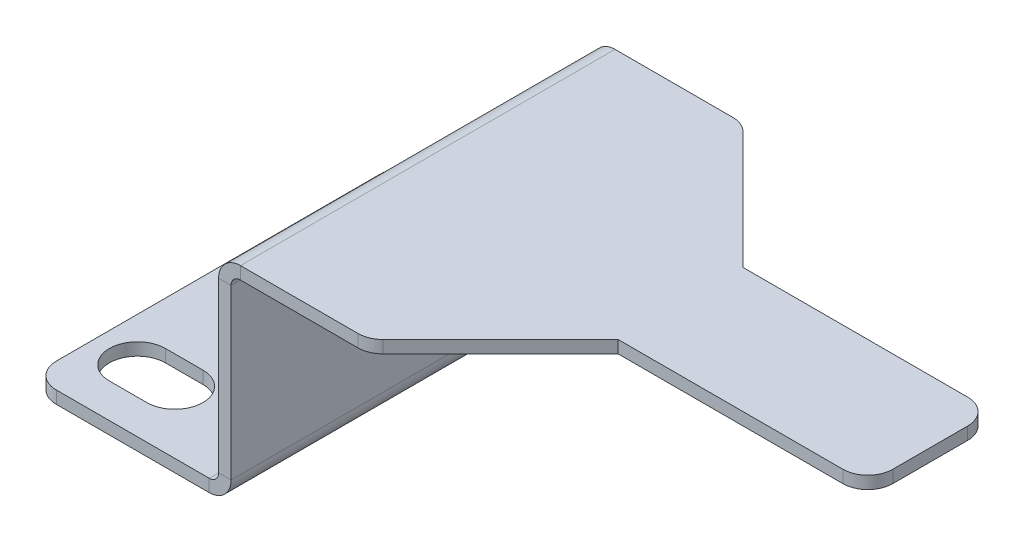
ISO-10303-21;
HEADER;
FILE_DESCRIPTION(('STEP AP214'),'2;1');
FILE_NAME('part.step','',(''),(''),'','','');
FILE_SCHEMA(('AUTOMOTIVE_DESIGN { 1 0 10303 214 1 1 1 1 }'));
ENDSEC;
DATA;
#1=APPLICATION_CONTEXT('core data for automotive mechanical design processes');
#2=APPLICATION_PROTOCOL_DEFINITION('international standard','automotive_design',2000,#1);
#3=PRODUCT_CONTEXT('',#1,'mechanical');
#4=PRODUCT('Part','Part','',(#3));
#5=PRODUCT_RELATED_PRODUCT_CATEGORY('part','',(#4));
#6=PRODUCT_DEFINITION_FORMATION('','',#4);
#7=PRODUCT_DEFINITION_CONTEXT('part definition',#1,'design');
#8=PRODUCT_DEFINITION('design','',#6,#7);
#9=PRODUCT_DEFINITION_SHAPE('','',#8);
#10=(LENGTH_UNIT() NAMED_UNIT(*) SI_UNIT(.MILLI.,.METRE.));
#11=(NAMED_UNIT(*) PLANE_ANGLE_UNIT() SI_UNIT($,.RADIAN.));
#12=(NAMED_UNIT(*) SI_UNIT($,.STERADIAN.) SOLID_ANGLE_UNIT());
#13=UNCERTAINTY_MEASURE_WITH_UNIT(LENGTH_MEASURE(1.E-05),#10,'distance_accuracy_value','');
#14=(GEOMETRIC_REPRESENTATION_CONTEXT(3) GLOBAL_UNCERTAINTY_ASSIGNED_CONTEXT((#13)) GLOBAL_UNIT_ASSIGNED_CONTEXT((#10,
#11,#12)) REPRESENTATION_CONTEXT('',''));
#15=CARTESIAN_POINT('',(0.,0.,0.));
#16=DIRECTION('',(0.,0.,1.));
#17=DIRECTION('',(1.,0.,0.));
#18=AXIS2_PLACEMENT_3D('',#15,#16,#17);
#19=CARTESIAN_POINT('',(15.,15.,30.));
#20=DIRECTION('',(0.,1.,0.));
#21=DIRECTION('',(0.,0.,1.));
#22=AXIS2_PLACEMENT_3D('',#19,#20,#21);
#23=PLANE('',#22);
#24=DIRECTION('',(1.,0.,0.));
#25=VECTOR('',#24,1.);
#26=CARTESIAN_POINT('',(15.,15.,0.));
#27=LINE('',#26,#25);
#28=CARTESIAN_POINT('',(16.75,15.,0.));
#29=VERTEX_POINT('',#28);
#30=CARTESIAN_POINT('',(26.1715728752538,15.,0.));
#31=VERTEX_POINT('',#30);
#32=EDGE_CURVE('E295',#29,#31,#27,.T.);
#33=ORIENTED_EDGE('',*,*,#32,.T.);
#34=CARTESIAN_POINT('',(26.1715728752538,15.,2.));
#35=DIRECTION('',(0.,1.,0.));
#36=DIRECTION('',(0.,0.,1.));
#37=AXIS2_PLACEMENT_3D('',#34,#35,#36);
#38=CIRCLE('',#37,2.);
#39=CARTESIAN_POINT('',(27.585786437627,15.,0.585786437626907));
#40=VERTEX_POINT('',#39);
#41=EDGE_CURVE('E460',#31,#40,#38,.F.);
#42=ORIENTED_EDGE('',*,*,#41,.T.);
#43=DIRECTION('',(0.707106781186547,0.,0.707106781186549));
#44=VECTOR('',#43,1.);
#45=CARTESIAN_POINT('',(36.,15.,9.));
#46=LINE('',#45,#44);
#47=CARTESIAN_POINT('',(37.,15.,10.));
#48=VERTEX_POINT('',#47);
#49=EDGE_CURVE('E288',#40,#48,#46,.T.);
#50=ORIENTED_EDGE('',*,*,#49,.T.);
#51=DIRECTION('',(1.,0.,0.));
#52=VECTOR('',#51,1.);
#53=CARTESIAN_POINT('',(15.,15.,10.));
#54=LINE('',#53,#52);
#55=CARTESIAN_POINT('',(55.,15.,10.));
#56=VERTEX_POINT('',#55);
#57=EDGE_CURVE('E283',#48,#56,#54,.T.);
#58=ORIENTED_EDGE('',*,*,#57,.T.);
#59=CARTESIAN_POINT('',(55.,15.,12.));
#60=DIRECTION('',(0.,1.,0.));
#61=DIRECTION('',(0.,0.,1.));
#62=AXIS2_PLACEMENT_3D('',#59,#60,#61);
#63=CIRCLE('',#62,2.);
#64=CARTESIAN_POINT('',(57.,15.,12.));
#65=VERTEX_POINT('',#64);
#66=EDGE_CURVE('E38',#56,#65,#63,.F.);
#67=ORIENTED_EDGE('',*,*,#66,.T.);
#68=DIRECTION('',(0.,0.,-1.));
#69=VECTOR('',#68,1.);
#70=CARTESIAN_POINT('',(57.,15.,30.));
#71=LINE('',#70,#69);
#72=CARTESIAN_POINT('',(57.,15.,18.));
#73=VERTEX_POINT('',#72);
#74=EDGE_CURVE('E384',#73,#65,#71,.T.);
#75=ORIENTED_EDGE('',*,*,#74,.F.);
#76=CARTESIAN_POINT('',(55.,15.,18.));
#77=DIRECTION('',(0.,1.,0.));
#78=DIRECTION('',(0.,0.,1.));
#79=AXIS2_PLACEMENT_3D('',#76,#77,#78);
#80=CIRCLE('',#79,2.);
#81=CARTESIAN_POINT('',(55.,15.,20.));
#82=VERTEX_POINT('',#81);
#83=EDGE_CURVE('E32',#73,#82,#80,.F.);
#84=ORIENTED_EDGE('',*,*,#83,.T.);
#85=DIRECTION('',(-1.,0.,0.));
#86=VECTOR('',#85,1.);
#87=CARTESIAN_POINT('',(15.,15.,20.));
#88=LINE('',#87,#86);
#89=CARTESIAN_POINT('',(37.,15.,20.));
#90=VERTEX_POINT('',#89);
#91=EDGE_CURVE('E275',#82,#90,#88,.T.);
#92=ORIENTED_EDGE('',*,*,#91,.T.);
#93=DIRECTION('',(-0.707106781186547,0.,0.707106781186549));
#94=VECTOR('',#93,1.);
#95=CARTESIAN_POINT('',(21.,15.,36.));
#96=LINE('',#95,#94);
#97=CARTESIAN_POINT('',(27.585786437627,15.,29.4142135623731));
#98=VERTEX_POINT('',#97);
#99=EDGE_CURVE('E270',#90,#98,#96,.T.);
#100=ORIENTED_EDGE('',*,*,#99,.T.);
#101=CARTESIAN_POINT('',(26.1715728752538,15.,28.));
#102=DIRECTION('',(0.,1.,0.));
#103=DIRECTION('',(0.,0.,1.));
#104=AXIS2_PLACEMENT_3D('',#101,#102,#103);
#105=CIRCLE('',#104,2.);
#106=CARTESIAN_POINT('',(26.1715728752538,15.,30.));
#107=VERTEX_POINT('',#106);
#108=EDGE_CURVE('E456',#98,#107,#105,.F.);
#109=ORIENTED_EDGE('',*,*,#108,.T.);
#110=DIRECTION('',(1.,0.,0.));
#111=VECTOR('',#110,1.);
#112=CARTESIAN_POINT('',(15.,15.,30.));
#113=LINE('',#112,#111);
#114=CARTESIAN_POINT('',(16.75,15.,30.));
#115=VERTEX_POINT('',#114);
#116=EDGE_CURVE('E296',#115,#107,#113,.T.);
#117=ORIENTED_EDGE('',*,*,#116,.F.);
#118=DIRECTION('',(0.,0.,-1.));
#119=VECTOR('',#118,1.);
#120=CARTESIAN_POINT('',(16.75,15.,30.));
#121=LINE('',#120,#119);
#122=EDGE_CURVE('E325',#115,#29,#121,.T.);
#123=ORIENTED_EDGE('',*,*,#122,.T.);
#124=EDGE_LOOP('',(#33,#42,#50,#58,#67,#75,#84,#92,#100,#109,#117,#123));
#125=FACE_BOUND('',#124,.T.);
#126=ADVANCED_FACE('F17',(#125),#23,.F.);
#127=CARTESIAN_POINT('',(57.,16.,30.));
#128=DIRECTION('',(1.,0.,0.));
#129=DIRECTION('',(0.,0.,-1.));
#130=AXIS2_PLACEMENT_3D('',#127,#128,#129);
#131=PLANE('',#130);
#132=ORIENTED_EDGE('',*,*,#74,.T.);
#133=DIRECTION('',(0.,-1.,0.));
#134=VECTOR('',#133,1.);
#135=CARTESIAN_POINT('',(57.,16.,12.));
#136=LINE('',#135,#134);
#137=CARTESIAN_POINT('',(57.,16.,12.));
#138=VERTEX_POINT('',#137);
#139=EDGE_CURVE('E464',#65,#138,#136,.F.);
#140=ORIENTED_EDGE('',*,*,#139,.T.);
#141=DIRECTION('',(0.,0.,-1.));
#142=VECTOR('',#141,1.);
#143=CARTESIAN_POINT('',(57.,16.,30.));
#144=LINE('',#143,#142);
#145=CARTESIAN_POINT('',(57.,16.,18.));
#146=VERTEX_POINT('',#145);
#147=EDGE_CURVE('E381',#146,#138,#144,.T.);
#148=ORIENTED_EDGE('',*,*,#147,.F.);
#149=DIRECTION('',(0.,-1.,0.));
#150=VECTOR('',#149,1.);
#151=CARTESIAN_POINT('',(57.,16.,18.));
#152=LINE('',#151,#150);
#153=EDGE_CURVE('E462',#146,#73,#152,.T.);
#154=ORIENTED_EDGE('',*,*,#153,.T.);
#155=EDGE_LOOP('',(#132,#140,#148,#154));
#156=FACE_BOUND('',#155,.T.);
#157=ADVANCED_FACE('F538',(#156),#131,.T.);
#158=CARTESIAN_POINT('',(15.,16.,30.));
#159=DIRECTION('',(0.,1.,0.));
#160=DIRECTION('',(0.,0.,1.));
#161=AXIS2_PLACEMENT_3D('',#158,#159,#160);
#162=PLANE('',#161);
#163=DIRECTION('',(0.707106781186547,0.,0.707106781186549));
#164=VECTOR('',#163,1.);
#165=CARTESIAN_POINT('',(36.,16.,9.));
#166=LINE('',#165,#164);
#167=CARTESIAN_POINT('',(27.585786437627,16.,0.585786437626907));
#168=VERTEX_POINT('',#167);
#169=CARTESIAN_POINT('',(37.,16.,10.));
#170=VERTEX_POINT('',#169);
#171=EDGE_CURVE('E287',#168,#170,#166,.T.);
#172=ORIENTED_EDGE('',*,*,#171,.F.);
#173=CARTESIAN_POINT('',(26.1715728752538,16.,2.));
#174=DIRECTION('',(0.,1.,0.));
#175=DIRECTION('',(0.,0.,1.));
#176=AXIS2_PLACEMENT_3D('',#173,#174,#175);
#177=CIRCLE('',#176,2.);
#178=CARTESIAN_POINT('',(26.1715728752538,16.,0.));
#179=VERTEX_POINT('',#178);
#180=EDGE_CURVE('E452',#168,#179,#177,.T.);
#181=ORIENTED_EDGE('',*,*,#180,.T.);
#182=DIRECTION('',(1.,0.,0.));
#183=VECTOR('',#182,1.);
#184=CARTESIAN_POINT('',(15.,16.,0.));
#185=LINE('',#184,#183);
#186=CARTESIAN_POINT('',(16.75,16.,0.));
#187=VERTEX_POINT('',#186);
#188=EDGE_CURVE('E328',#187,#179,#185,.T.);
#189=ORIENTED_EDGE('',*,*,#188,.F.);
#190=DIRECTION('',(0.,0.,-1.));
#191=VECTOR('',#190,1.);
#192=CARTESIAN_POINT('',(16.75,16.,30.));
#193=LINE('',#192,#191);
#194=CARTESIAN_POINT('',(16.75,16.,30.));
#195=VERTEX_POINT('',#194);
#196=EDGE_CURVE('E378',#195,#187,#193,.T.);
#197=ORIENTED_EDGE('',*,*,#196,.F.);
#198=DIRECTION('',(1.,0.,0.));
#199=VECTOR('',#198,1.);
#200=CARTESIAN_POINT('',(15.,16.,30.));
#201=LINE('',#200,#199);
#202=CARTESIAN_POINT('',(26.1715728752538,16.,30.));
#203=VERTEX_POINT('',#202);
#204=EDGE_CURVE('E299',#195,#203,#201,.T.);
#205=ORIENTED_EDGE('',*,*,#204,.T.);
#206=CARTESIAN_POINT('',(26.1715728752538,16.,28.));
#207=DIRECTION('',(0.,1.,0.));
#208=DIRECTION('',(0.,0.,1.));
#209=AXIS2_PLACEMENT_3D('',#206,#207,#208);
#210=CIRCLE('',#209,2.);
#211=CARTESIAN_POINT('',(27.585786437627,16.,29.4142135623731));
#212=VERTEX_POINT('',#211);
#213=EDGE_CURVE('E446',#203,#212,#210,.T.);
#214=ORIENTED_EDGE('',*,*,#213,.T.);
#215=DIRECTION('',(-0.707106781186547,0.,0.707106781186549));
#216=VECTOR('',#215,1.);
#217=CARTESIAN_POINT('',(21.,16.,36.));
#218=LINE('',#217,#216);
#219=CARTESIAN_POINT('',(37.,16.,20.));
#220=VERTEX_POINT('',#219);
#221=EDGE_CURVE('E271',#220,#212,#218,.T.);
#222=ORIENTED_EDGE('',*,*,#221,.F.);
#223=DIRECTION('',(1.,0.,0.));
#224=VECTOR('',#223,1.);
#225=CARTESIAN_POINT('',(15.,16.,20.));
#226=LINE('',#225,#224);
#227=CARTESIAN_POINT('',(55.,16.,20.));
#228=VERTEX_POINT('',#227);
#229=EDGE_CURVE('E274',#228,#220,#226,.F.);
#230=ORIENTED_EDGE('',*,*,#229,.F.);
#231=CARTESIAN_POINT('',(55.,16.,18.));
#232=DIRECTION('',(0.,1.,0.));
#233=DIRECTION('',(0.,0.,1.));
#234=AXIS2_PLACEMENT_3D('',#231,#232,#233);
#235=CIRCLE('',#234,2.);
#236=EDGE_CURVE('E448',#228,#146,#235,.T.);
#237=ORIENTED_EDGE('',*,*,#236,.T.);
#238=ORIENTED_EDGE('',*,*,#147,.T.);
#239=CARTESIAN_POINT('',(55.,16.,12.));
#240=DIRECTION('',(0.,1.,0.));
#241=DIRECTION('',(0.,0.,1.));
#242=AXIS2_PLACEMENT_3D('',#239,#240,#241);
#243=CIRCLE('',#242,2.);
#244=CARTESIAN_POINT('',(55.,16.,10.));
#245=VERTEX_POINT('',#244);
#246=EDGE_CURVE('E450',#138,#245,#243,.T.);
#247=ORIENTED_EDGE('',*,*,#246,.T.);
#248=DIRECTION('',(1.,0.,0.));
#249=VECTOR('',#248,1.);
#250=CARTESIAN_POINT('',(15.,16.,10.));
#251=LINE('',#250,#249);
#252=EDGE_CURVE('E284',#170,#245,#251,.T.);
#253=ORIENTED_EDGE('',*,*,#252,.F.);
#254=EDGE_LOOP('',(#172,#181,#189,#197,#205,#214,#222,#230,#237,#238,#247,#253));
#255=FACE_BOUND('',#254,.T.);
#256=ADVANCED_FACE('F482',(#255),#162,.T.);
#257=CARTESIAN_POINT('',(16.,14.25,30.));
#258=DIRECTION('',(0.,0.,1.));
#259=DIRECTION('',(1.,0.,0.));
#260=AXIS2_PLACEMENT_3D('',#257,#258,#259);
#261=PLANE('',#260);
#262=ORIENTED_EDGE('',*,*,#116,.T.);
#263=DIRECTION('',(0.,-1.,0.));
#264=VECTOR('',#263,1.);
#265=CARTESIAN_POINT('',(26.1715728752538,14.25,30.));
#266=LINE('',#265,#264);
#267=EDGE_CURVE('E25',#107,#203,#266,.F.);
#268=ORIENTED_EDGE('',*,*,#267,.T.);
#269=ORIENTED_EDGE('',*,*,#204,.F.);
#270=DIRECTION('',(0.,-1.,0.));
#271=VECTOR('',#270,1.);
#272=CARTESIAN_POINT('',(16.75,16.,30.));
#273=LINE('',#272,#271);
#274=EDGE_CURVE('E392',#195,#115,#273,.T.);
#275=ORIENTED_EDGE('',*,*,#274,.T.);
#276=EDGE_LOOP('',(#262,#268,#269,#275));
#277=FACE_BOUND('',#276,.T.);
#278=ADVANCED_FACE('F475',(#277),#261,.T.);
#279=CARTESIAN_POINT('',(16.75,14.25,0.));
#280=DIRECTION('',(0.,0.,1.));
#281=DIRECTION('',(1.,0.,0.));
#282=AXIS2_PLACEMENT_3D('',#279,#280,#281);
#283=PLANE('',#282);
#284=ORIENTED_EDGE('',*,*,#188,.T.);
#285=DIRECTION('',(0.,-1.,0.));
#286=VECTOR('',#285,1.);
#287=CARTESIAN_POINT('',(26.1715728752538,15.,0.));
#288=LINE('',#287,#286);
#289=EDGE_CURVE('E454',#179,#31,#288,.T.);
#290=ORIENTED_EDGE('',*,*,#289,.T.);
#291=ORIENTED_EDGE('',*,*,#32,.F.);
#292=DIRECTION('',(0.,1.,0.));
#293=VECTOR('',#292,1.);
#294=CARTESIAN_POINT('',(16.75,15.,0.));
#295=LINE('',#294,#293);
#296=EDGE_CURVE('E386',#29,#187,#295,.T.);
#297=ORIENTED_EDGE('',*,*,#296,.T.);
#298=EDGE_LOOP('',(#284,#290,#291,#297));
#299=FACE_BOUND('',#298,.T.);
#300=ADVANCED_FACE('F577',(#299),#283,.F.);
#301=CARTESIAN_POINT('',(15.,0.75,30.));
#302=DIRECTION('',(0.,0.,1.));
#303=DIRECTION('',(1.,0.,0.));
#304=AXIS2_PLACEMENT_3D('',#301,#302,#303);
#305=PLANE('',#304);
#306=DIRECTION('',(1.,0.,0.));
#307=VECTOR('',#306,1.);
#308=CARTESIAN_POINT('',(15.,0.75,30.));
#309=LINE('',#308,#307);
#310=CARTESIAN_POINT('',(15.,0.75,30.));
#311=VERTEX_POINT('',#310);
#312=CARTESIAN_POINT('',(16.,0.75,30.));
#313=VERTEX_POINT('',#312);
#314=EDGE_CURVE('E402',#311,#313,#309,.T.);
#315=ORIENTED_EDGE('',*,*,#314,.F.);
#316=CARTESIAN_POINT('',(14.25,0.75,30.));
#317=DIRECTION('',(0.,0.,-1.));
#318=DIRECTION('',(-1.,0.,0.));
#319=AXIS2_PLACEMENT_3D('',#316,#317,#318);
#320=CIRCLE('',#319,0.75);
#321=CARTESIAN_POINT('',(14.25,0.,30.));
#322=VERTEX_POINT('',#321);
#323=EDGE_CURVE('E309',#322,#311,#320,.F.);
#324=ORIENTED_EDGE('',*,*,#323,.F.);
#325=DIRECTION('',(0.,1.,0.));
#326=VECTOR('',#325,1.);
#327=CARTESIAN_POINT('',(14.25,-1.,30.));
#328=LINE('',#327,#326);
#329=CARTESIAN_POINT('',(14.25,-1.,30.));
#330=VERTEX_POINT('',#329);
#331=EDGE_CURVE('E399',#330,#322,#328,.T.);
#332=ORIENTED_EDGE('',*,*,#331,.F.);
#333=CARTESIAN_POINT('',(14.25,0.75,30.));
#334=DIRECTION('',(0.,0.,1.));
#335=DIRECTION('',(1.,0.,0.));
#336=AXIS2_PLACEMENT_3D('',#333,#334,#335);
#337=CIRCLE('',#336,1.75);
#338=EDGE_CURVE('E316',#330,#313,#337,.T.);
#339=ORIENTED_EDGE('',*,*,#338,.T.);
#340=EDGE_LOOP('',(#315,#324,#332,#339));
#341=FACE_BOUND('',#340,.T.);
#342=ADVANCED_FACE('F506',(#341),#305,.T.);
#343=CARTESIAN_POINT('',(14.25,-1.,30.));
#344=DIRECTION('',(0.,0.,1.));
#345=DIRECTION('',(1.,0.,0.));
#346=AXIS2_PLACEMENT_3D('',#343,#344,#345);
#347=PLANE('',#346);
#348=DIRECTION('',(0.,1.,0.));
#349=VECTOR('',#348,1.);
#350=CARTESIAN_POINT('',(15.,0.,30.));
#351=LINE('',#350,#349);
#352=CARTESIAN_POINT('',(15.,14.25,30.));
#353=VERTEX_POINT('',#352);
#354=EDGE_CURVE('E306',#311,#353,#351,.T.);
#355=ORIENTED_EDGE('',*,*,#354,.F.);
#356=ORIENTED_EDGE('',*,*,#314,.T.);
#357=DIRECTION('',(0.,1.,0.));
#358=VECTOR('',#357,1.);
#359=CARTESIAN_POINT('',(16.,0.,30.));
#360=LINE('',#359,#358);
#361=CARTESIAN_POINT('',(16.,14.25,30.));
#362=VERTEX_POINT('',#361);
#363=EDGE_CURVE('E319',#313,#362,#360,.T.);
#364=ORIENTED_EDGE('',*,*,#363,.T.);
#365=DIRECTION('',(-1.,0.,0.));
#366=VECTOR('',#365,1.);
#367=CARTESIAN_POINT('',(16.,14.25,30.));
#368=LINE('',#367,#366);
#369=EDGE_CURVE('E390',#362,#353,#368,.T.);
#370=ORIENTED_EDGE('',*,*,#369,.T.);
#371=EDGE_LOOP('',(#355,#356,#364,#370));
#372=FACE_BOUND('',#371,.T.);
#373=ADVANCED_FACE('F498',(#372),#347,.T.);
#374=CARTESIAN_POINT('',(14.25,0.,0.));
#375=DIRECTION('',(0.,0.,-1.));
#376=DIRECTION('',(-1.,0.,0.));
#377=AXIS2_PLACEMENT_3D('',#374,#375,#376);
#378=PLANE('',#377);
#379=DIRECTION('',(0.,-1.,0.));
#380=VECTOR('',#379,1.);
#381=CARTESIAN_POINT('',(14.25,0.,0.));
#382=LINE('',#381,#380);
#383=CARTESIAN_POINT('',(14.25,0.,0.));
#384=VERTEX_POINT('',#383);
#385=CARTESIAN_POINT('',(14.25,-1.,0.));
#386=VERTEX_POINT('',#385);
#387=EDGE_CURVE('E396',#384,#386,#382,.T.);
#388=ORIENTED_EDGE('',*,*,#387,.F.);
#389=CARTESIAN_POINT('',(14.25,0.75,0.));
#390=DIRECTION('',(0.,0.,-1.));
#391=DIRECTION('',(-1.,0.,0.));
#392=AXIS2_PLACEMENT_3D('',#389,#390,#391);
#393=CIRCLE('',#392,0.75);
#394=CARTESIAN_POINT('',(15.,0.75,0.));
#395=VERTEX_POINT('',#394);
#396=EDGE_CURVE('E337',#384,#395,#393,.F.);
#397=ORIENTED_EDGE('',*,*,#396,.T.);
#398=DIRECTION('',(-1.,0.,0.));
#399=VECTOR('',#398,1.);
#400=CARTESIAN_POINT('',(16.,0.75,0.));
#401=LINE('',#400,#399);
#402=CARTESIAN_POINT('',(16.,0.75,0.));
#403=VERTEX_POINT('',#402);
#404=EDGE_CURVE('E394',#403,#395,#401,.T.);
#405=ORIENTED_EDGE('',*,*,#404,.F.);
#406=CARTESIAN_POINT('',(14.25,0.75,0.));
#407=DIRECTION('',(0.,0.,1.));
#408=DIRECTION('',(1.,0.,0.));
#409=AXIS2_PLACEMENT_3D('',#406,#407,#408);
#410=CIRCLE('',#409,1.75);
#411=EDGE_CURVE('E344',#386,#403,#410,.T.);
#412=ORIENTED_EDGE('',*,*,#411,.F.);
#413=EDGE_LOOP('',(#388,#397,#405,#412));
#414=FACE_BOUND('',#413,.T.);
#415=ADVANCED_FACE('F583',(#414),#378,.T.);
#416=CARTESIAN_POINT('',(16.,0.75,0.));
#417=DIRECTION('',(0.,0.,-1.));
#418=DIRECTION('',(-1.,0.,0.));
#419=AXIS2_PLACEMENT_3D('',#416,#417,#418);
#420=PLANE('',#419);
#421=DIRECTION('',(1.,0.,0.));
#422=VECTOR('',#421,1.);
#423=CARTESIAN_POINT('',(0.,-1.,0.));
#424=LINE('',#423,#422);
#425=CARTESIAN_POINT('',(2.,-1.,0.));
#426=VERTEX_POINT('',#425);
#427=EDGE_CURVE('E342',#426,#386,#424,.T.);
#428=ORIENTED_EDGE('',*,*,#427,.F.);
#429=DIRECTION('',(0.,1.,0.));
#430=VECTOR('',#429,1.);
#431=CARTESIAN_POINT('',(2.,0.75,0.));
#432=LINE('',#431,#430);
#433=CARTESIAN_POINT('',(2.,0.,0.));
#434=VERTEX_POINT('',#433);
#435=EDGE_CURVE('E440',#426,#434,#432,.T.);
#436=ORIENTED_EDGE('',*,*,#435,.T.);
#437=DIRECTION('',(1.,0.,0.));
#438=VECTOR('',#437,1.);
#439=CARTESIAN_POINT('',(0.,0.,0.));
#440=LINE('',#439,#438);
#441=EDGE_CURVE('E340',#434,#384,#440,.T.);
#442=ORIENTED_EDGE('',*,*,#441,.T.);
#443=ORIENTED_EDGE('',*,*,#387,.T.);
#444=EDGE_LOOP('',(#428,#436,#442,#443));
#445=FACE_BOUND('',#444,.T.);
#446=ADVANCED_FACE('F580',(#445),#420,.T.);
#447=CARTESIAN_POINT('',(16.75,16.,30.));
#448=DIRECTION('',(0.,0.,1.));
#449=DIRECTION('',(1.,0.,0.));
#450=AXIS2_PLACEMENT_3D('',#447,#448,#449);
#451=PLANE('',#450);
#452=ORIENTED_EDGE('',*,*,#274,.F.);
#453=CARTESIAN_POINT('',(16.75,14.25,30.));
#454=DIRECTION('',(0.,0.,1.));
#455=DIRECTION('',(1.,0.,0.));
#456=AXIS2_PLACEMENT_3D('',#453,#454,#455);
#457=CIRCLE('',#456,1.75);
#458=EDGE_CURVE('E303',#353,#195,#457,.F.);
#459=ORIENTED_EDGE('',*,*,#458,.F.);
#460=ORIENTED_EDGE('',*,*,#369,.F.);
#461=CARTESIAN_POINT('',(16.75,14.25,30.));
#462=DIRECTION('',(0.,0.,1.));
#463=DIRECTION('',(1.,0.,0.));
#464=AXIS2_PLACEMENT_3D('',#461,#462,#463);
#465=CIRCLE('',#464,0.75);
#466=EDGE_CURVE('E322',#362,#115,#465,.F.);
#467=ORIENTED_EDGE('',*,*,#466,.T.);
#468=EDGE_LOOP('',(#452,#459,#460,#467));
#469=FACE_BOUND('',#468,.T.);
#470=ADVANCED_FACE('F491',(#469),#451,.T.);
#471=CARTESIAN_POINT('',(15.,14.25,0.));
#472=DIRECTION('',(0.,0.,-1.));
#473=DIRECTION('',(-1.,0.,0.));
#474=AXIS2_PLACEMENT_3D('',#471,#472,#473);
#475=PLANE('',#474);
#476=DIRECTION('',(1.,0.,0.));
#477=VECTOR('',#476,1.);
#478=CARTESIAN_POINT('',(15.,14.25,0.));
#479=LINE('',#478,#477);
#480=CARTESIAN_POINT('',(15.,14.25,0.));
#481=VERTEX_POINT('',#480);
#482=CARTESIAN_POINT('',(16.,14.25,0.));
#483=VERTEX_POINT('',#482);
#484=EDGE_CURVE('E388',#481,#483,#479,.T.);
#485=ORIENTED_EDGE('',*,*,#484,.F.);
#486=CARTESIAN_POINT('',(16.75,14.25,0.));
#487=DIRECTION('',(0.,0.,1.));
#488=DIRECTION('',(1.,0.,0.));
#489=AXIS2_PLACEMENT_3D('',#486,#487,#488);
#490=CIRCLE('',#489,1.75);
#491=EDGE_CURVE('E331',#481,#187,#490,.F.);
#492=ORIENTED_EDGE('',*,*,#491,.T.);
#493=ORIENTED_EDGE('',*,*,#296,.F.);
#494=CARTESIAN_POINT('',(16.75,14.25,0.));
#495=DIRECTION('',(0.,0.,1.));
#496=DIRECTION('',(1.,0.,0.));
#497=AXIS2_PLACEMENT_3D('',#494,#495,#496);
#498=CIRCLE('',#497,0.75);
#499=EDGE_CURVE('E300',#483,#29,#498,.F.);
#500=ORIENTED_EDGE('',*,*,#499,.F.);
#501=EDGE_LOOP('',(#485,#492,#493,#500));
#502=FACE_BOUND('',#501,.T.);
#503=ADVANCED_FACE('F570',(#502),#475,.T.);
#504=CARTESIAN_POINT('',(16.75,15.,0.));
#505=DIRECTION('',(0.,0.,-1.));
#506=DIRECTION('',(-1.,0.,0.));
#507=AXIS2_PLACEMENT_3D('',#504,#505,#506);
#508=PLANE('',#507);
#509=DIRECTION('',(0.,1.,0.));
#510=VECTOR('',#509,1.);
#511=CARTESIAN_POINT('',(15.,0.,0.));
#512=LINE('',#511,#510);
#513=EDGE_CURVE('E334',#395,#481,#512,.T.);
#514=ORIENTED_EDGE('',*,*,#513,.T.);
#515=ORIENTED_EDGE('',*,*,#484,.T.);
#516=DIRECTION('',(0.,1.,0.));
#517=VECTOR('',#516,1.);
#518=CARTESIAN_POINT('',(16.,0.,0.));
#519=LINE('',#518,#517);
#520=EDGE_CURVE('E347',#403,#483,#519,.T.);
#521=ORIENTED_EDGE('',*,*,#520,.F.);
#522=ORIENTED_EDGE('',*,*,#404,.T.);
#523=EDGE_LOOP('',(#514,#515,#521,#522));
#524=FACE_BOUND('',#523,.T.);
#525=ADVANCED_FACE('F567',(#524),#508,.T.);
#526=CARTESIAN_POINT('',(16.75,14.25,30.));
#527=DIRECTION('',(0.,0.,-1.));
#528=DIRECTION('',(-1.,0.,0.));
#529=AXIS2_PLACEMENT_3D('',#526,#527,#528);
#530=CYLINDRICAL_SURFACE('',#529,1.75);
#531=ORIENTED_EDGE('',*,*,#491,.F.);
#532=DIRECTION('',(0.,0.,-1.));
#533=VECTOR('',#532,1.);
#534=CARTESIAN_POINT('',(15.,14.25,30.));
#535=LINE('',#534,#533);
#536=EDGE_CURVE('E375',#353,#481,#535,.T.);
#537=ORIENTED_EDGE('',*,*,#536,.F.);
#538=ORIENTED_EDGE('',*,*,#458,.T.);
#539=ORIENTED_EDGE('',*,*,#196,.T.);
#540=EDGE_LOOP('',(#531,#537,#538,#539));
#541=FACE_BOUND('',#540,.T.);
#542=ADVANCED_FACE('F487',(#541),#530,.T.);
#543=CARTESIAN_POINT('',(15.,0.,30.));
#544=DIRECTION('',(-1.,0.,0.));
#545=DIRECTION('',(0.,0.,1.));
#546=AXIS2_PLACEMENT_3D('',#543,#544,#545);
#547=PLANE('',#546);
#548=ORIENTED_EDGE('',*,*,#513,.F.);
#549=DIRECTION('',(0.,0.,-1.));
#550=VECTOR('',#549,1.);
#551=CARTESIAN_POINT('',(15.,0.75,30.));
#552=LINE('',#551,#550);
#553=EDGE_CURVE('E372',#311,#395,#552,.T.);
#554=ORIENTED_EDGE('',*,*,#553,.F.);
#555=ORIENTED_EDGE('',*,*,#354,.T.);
#556=ORIENTED_EDGE('',*,*,#536,.T.);
#557=EDGE_LOOP('',(#548,#554,#555,#556));
#558=FACE_BOUND('',#557,.T.);
#559=ADVANCED_FACE('F496',(#558),#547,.T.);
#560=CARTESIAN_POINT('',(14.25,0.75,30.));
#561=DIRECTION('',(0.,0.,-1.));
#562=DIRECTION('',(-1.,0.,0.));
#563=AXIS2_PLACEMENT_3D('',#560,#561,#562);
#564=CYLINDRICAL_SURFACE('',#563,0.75);
#565=ORIENTED_EDGE('',*,*,#396,.F.);
#566=DIRECTION('',(0.,0.,-1.));
#567=VECTOR('',#566,1.);
#568=CARTESIAN_POINT('',(14.25,0.,30.));
#569=LINE('',#568,#567);
#570=EDGE_CURVE('E369',#322,#384,#569,.T.);
#571=ORIENTED_EDGE('',*,*,#570,.F.);
#572=ORIENTED_EDGE('',*,*,#323,.T.);
#573=ORIENTED_EDGE('',*,*,#553,.T.);
#574=EDGE_LOOP('',(#565,#571,#572,#573));
#575=FACE_BOUND('',#574,.T.);
#576=ADVANCED_FACE('F503',(#575),#564,.F.);
#577=CARTESIAN_POINT('',(0.,0.,30.));
#578=DIRECTION('',(0.,1.,0.));
#579=DIRECTION('',(0.,0.,1.));
#580=AXIS2_PLACEMENT_3D('',#577,#578,#579);
#581=PLANE('',#580);
#582=DIRECTION('',(1.,0.,0.));
#583=VECTOR('',#582,1.);
#584=CARTESIAN_POINT('',(3.5,0.,27.25));
#585=LINE('',#584,#583);
#586=CARTESIAN_POINT('',(3.5,0.,27.25));
#587=VERTEX_POINT('',#586);
#588=CARTESIAN_POINT('',(6.5,0.,27.25));
#589=VERTEX_POINT('',#588);
#590=EDGE_CURVE('E240',#587,#589,#585,.T.);
#591=ORIENTED_EDGE('',*,*,#590,.F.);
#592=CARTESIAN_POINT('',(3.5,0.,25.));
#593=DIRECTION('',(0.,1.,0.));
#594=DIRECTION('',(0.,0.,1.));
#595=AXIS2_PLACEMENT_3D('',#592,#593,#594);
#596=CIRCLE('',#595,2.25);
#597=CARTESIAN_POINT('',(3.5,0.,22.75));
#598=VERTEX_POINT('',#597);
#599=EDGE_CURVE('E239',#598,#587,#596,.T.);
#600=ORIENTED_EDGE('',*,*,#599,.F.);
#601=DIRECTION('',(1.,0.,0.));
#602=VECTOR('',#601,1.);
#603=CARTESIAN_POINT('',(3.5,0.,22.75));
#604=LINE('',#603,#602);
#605=CARTESIAN_POINT('',(6.5,0.,22.75));
#606=VERTEX_POINT('',#605);
#607=EDGE_CURVE('E219',#598,#606,#604,.T.);
#608=ORIENTED_EDGE('',*,*,#607,.T.);
#609=CARTESIAN_POINT('',(6.5,0.,25.));
#610=DIRECTION('',(0.,1.,0.));
#611=DIRECTION('',(0.,0.,1.));
#612=AXIS2_PLACEMENT_3D('',#609,#610,#611);
#613=CIRCLE('',#612,2.25);
#614=EDGE_CURVE('E226',#589,#606,#613,.T.);
#615=ORIENTED_EDGE('',*,*,#614,.F.);
#616=EDGE_LOOP('',(#591,#600,#608,#615));
#617=FACE_BOUND('',#616,.T.);
#618=CARTESIAN_POINT('',(6.5,0.,5.));
#619=DIRECTION('',(0.,1.,0.));
#620=DIRECTION('',(0.,0.,1.));
#621=AXIS2_PLACEMENT_3D('',#618,#619,#620);
#622=CIRCLE('',#621,2.25);
#623=CARTESIAN_POINT('',(6.5,0.,7.25));
#624=VERTEX_POINT('',#623);
#625=CARTESIAN_POINT('',(6.5,0.,2.75));
#626=VERTEX_POINT('',#625);
#627=EDGE_CURVE('E262',#624,#626,#622,.T.);
#628=ORIENTED_EDGE('',*,*,#627,.F.);
#629=DIRECTION('',(1.,0.,0.));
#630=VECTOR('',#629,1.);
#631=CARTESIAN_POINT('',(3.5,0.,7.25));
#632=LINE('',#631,#630);
#633=CARTESIAN_POINT('',(3.5,0.,7.25));
#634=VERTEX_POINT('',#633);
#635=EDGE_CURVE('E249',#634,#624,#632,.T.);
#636=ORIENTED_EDGE('',*,*,#635,.F.);
#637=CARTESIAN_POINT('',(3.5,0.,5.));
#638=DIRECTION('',(0.,1.,0.));
#639=DIRECTION('',(0.,0.,1.));
#640=AXIS2_PLACEMENT_3D('',#637,#638,#639);
#641=CIRCLE('',#640,2.25);
#642=CARTESIAN_POINT('',(3.5,0.,2.75));
#643=VERTEX_POINT('',#642);
#644=EDGE_CURVE('E254',#643,#634,#641,.T.);
#645=ORIENTED_EDGE('',*,*,#644,.F.);
#646=DIRECTION('',(1.,0.,0.));
#647=VECTOR('',#646,1.);
#648=CARTESIAN_POINT('',(3.5,0.,2.75));
#649=LINE('',#648,#647);
#650=EDGE_CURVE('E251',#643,#626,#649,.T.);
#651=ORIENTED_EDGE('',*,*,#650,.T.);
#652=EDGE_LOOP('',(#628,#636,#645,#651));
#653=FACE_BOUND('',#652,.T.);
#654=DIRECTION('',(0.,0.,-1.));
#655=VECTOR('',#654,1.);
#656=CARTESIAN_POINT('',(0.,0.,30.));
#657=LINE('',#656,#655);
#658=CARTESIAN_POINT('',(0.,0.,28.));
#659=VERTEX_POINT('',#658);
#660=CARTESIAN_POINT('',(0.,0.,2.));
#661=VERTEX_POINT('',#660);
#662=EDGE_CURVE('E366',#659,#661,#657,.T.);
#663=ORIENTED_EDGE('',*,*,#662,.F.);
#664=CARTESIAN_POINT('',(2.,0.,28.));
#665=DIRECTION('',(0.,1.,0.));
#666=DIRECTION('',(0.,0.,1.));
#667=AXIS2_PLACEMENT_3D('',#664,#665,#666);
#668=CIRCLE('',#667,2.);
#669=CARTESIAN_POINT('',(2.,0.,30.));
#670=VERTEX_POINT('',#669);
#671=EDGE_CURVE('E432',#659,#670,#668,.T.);
#672=ORIENTED_EDGE('',*,*,#671,.T.);
#673=DIRECTION('',(1.,0.,0.));
#674=VECTOR('',#673,1.);
#675=CARTESIAN_POINT('',(0.,0.,30.));
#676=LINE('',#675,#674);
#677=EDGE_CURVE('E312',#670,#322,#676,.T.);
#678=ORIENTED_EDGE('',*,*,#677,.T.);
#679=ORIENTED_EDGE('',*,*,#570,.T.);
#680=ORIENTED_EDGE('',*,*,#441,.F.);
#681=CARTESIAN_POINT('',(2.,0.,2.));
#682=DIRECTION('',(0.,1.,0.));
#683=DIRECTION('',(0.,0.,1.));
#684=AXIS2_PLACEMENT_3D('',#681,#682,#683);
#685=CIRCLE('',#684,2.);
#686=EDGE_CURVE('E430',#434,#661,#685,.T.);
#687=ORIENTED_EDGE('',*,*,#686,.T.);
#688=EDGE_LOOP('',(#663,#672,#678,#679,#680,#687));
#689=FACE_BOUND('',#688,.T.);
#690=ADVANCED_FACE('F236',(#617,#653,#689),#581,.T.);
#691=CARTESIAN_POINT('',(0.,-1.,30.));
#692=DIRECTION('',(-1.,0.,0.));
#693=DIRECTION('',(0.,0.,1.));
#694=AXIS2_PLACEMENT_3D('',#691,#692,#693);
#695=PLANE('',#694);
#696=DIRECTION('',(0.,0.,-1.));
#697=VECTOR('',#696,1.);
#698=CARTESIAN_POINT('',(0.,-1.,30.));
#699=LINE('',#698,#697);
#700=CARTESIAN_POINT('',(0.,-1.,28.));
#701=VERTEX_POINT('',#700);
#702=CARTESIAN_POINT('',(0.,-1.,2.));
#703=VERTEX_POINT('',#702);
#704=EDGE_CURVE('E363',#701,#703,#699,.T.);
#705=ORIENTED_EDGE('',*,*,#704,.F.);
#706=DIRECTION('',(0.,1.,0.));
#707=VECTOR('',#706,1.);
#708=CARTESIAN_POINT('',(0.,-1.,28.));
#709=LINE('',#708,#707);
#710=EDGE_CURVE('E427',#701,#659,#709,.T.);
#711=ORIENTED_EDGE('',*,*,#710,.T.);
#712=ORIENTED_EDGE('',*,*,#662,.T.);
#713=DIRECTION('',(0.,1.,0.));
#714=VECTOR('',#713,1.);
#715=CARTESIAN_POINT('',(0.,-1.,2.));
#716=LINE('',#715,#714);
#717=EDGE_CURVE('E425',#661,#703,#716,.F.);
#718=ORIENTED_EDGE('',*,*,#717,.T.);
#719=EDGE_LOOP('',(#705,#711,#712,#718));
#720=FACE_BOUND('',#719,.T.);
#721=ADVANCED_FACE('F642',(#720),#695,.T.);
#722=CARTESIAN_POINT('',(0.,-1.,30.));
#723=DIRECTION('',(0.,1.,0.));
#724=DIRECTION('',(0.,0.,1.));
#725=AXIS2_PLACEMENT_3D('',#722,#723,#724);
#726=PLANE('',#725);
#727=CARTESIAN_POINT('',(6.5,-1.,25.));
#728=DIRECTION('',(0.,1.,0.));
#729=DIRECTION('',(0.,0.,1.));
#730=AXIS2_PLACEMENT_3D('',#727,#728,#729);
#731=CIRCLE('',#730,2.25);
#732=CARTESIAN_POINT('',(6.5,-1.,27.25));
#733=VERTEX_POINT('',#732);
#734=CARTESIAN_POINT('',(6.5,-1.,22.75));
#735=VERTEX_POINT('',#734);
#736=EDGE_CURVE('E422',#733,#735,#731,.T.);
#737=ORIENTED_EDGE('',*,*,#736,.T.);
#738=DIRECTION('',(-1.,0.,0.));
#739=VECTOR('',#738,1.);
#740=CARTESIAN_POINT('',(0.,-1.,22.75));
#741=LINE('',#740,#739);
#742=CARTESIAN_POINT('',(3.5,-1.,22.75));
#743=VERTEX_POINT('',#742);
#744=EDGE_CURVE('E222',#735,#743,#741,.T.);
#745=ORIENTED_EDGE('',*,*,#744,.T.);
#746=CARTESIAN_POINT('',(3.5,-1.,25.));
#747=DIRECTION('',(0.,1.,0.));
#748=DIRECTION('',(0.,0.,1.));
#749=AXIS2_PLACEMENT_3D('',#746,#747,#748);
#750=CIRCLE('',#749,2.25);
#751=CARTESIAN_POINT('',(3.5,-1.,27.25));
#752=VERTEX_POINT('',#751);
#753=EDGE_CURVE('E419',#743,#752,#750,.T.);
#754=ORIENTED_EDGE('',*,*,#753,.T.);
#755=DIRECTION('',(1.,0.,0.));
#756=VECTOR('',#755,1.);
#757=CARTESIAN_POINT('',(0.,-1.,27.25));
#758=LINE('',#757,#756);
#759=EDGE_CURVE('E416',#752,#733,#758,.T.);
#760=ORIENTED_EDGE('',*,*,#759,.T.);
#761=EDGE_LOOP('',(#737,#745,#754,#760));
#762=FACE_BOUND('',#761,.T.);
#763=CARTESIAN_POINT('',(6.5,-1.,5.));
#764=DIRECTION('',(0.,1.,0.));
#765=DIRECTION('',(0.,0.,1.));
#766=AXIS2_PLACEMENT_3D('',#763,#764,#765);
#767=CIRCLE('',#766,2.25);
#768=CARTESIAN_POINT('',(6.5,-1.,7.25));
#769=VERTEX_POINT('',#768);
#770=CARTESIAN_POINT('',(6.5,-1.,2.75));
#771=VERTEX_POINT('',#770);
#772=EDGE_CURVE('E410',#769,#771,#767,.T.);
#773=ORIENTED_EDGE('',*,*,#772,.T.);
#774=DIRECTION('',(-1.,0.,0.));
#775=VECTOR('',#774,1.);
#776=CARTESIAN_POINT('',(0.,-1.,2.75));
#777=LINE('',#776,#775);
#778=CARTESIAN_POINT('',(3.5,-1.,2.75));
#779=VERTEX_POINT('',#778);
#780=EDGE_CURVE('E413',#771,#779,#777,.T.);
#781=ORIENTED_EDGE('',*,*,#780,.T.);
#782=CARTESIAN_POINT('',(3.5,-1.,5.));
#783=DIRECTION('',(0.,1.,0.));
#784=DIRECTION('',(0.,0.,1.));
#785=AXIS2_PLACEMENT_3D('',#782,#783,#784);
#786=CIRCLE('',#785,2.25);
#787=CARTESIAN_POINT('',(3.5,-1.,7.25));
#788=VERTEX_POINT('',#787);
#789=EDGE_CURVE('E407',#779,#788,#786,.T.);
#790=ORIENTED_EDGE('',*,*,#789,.T.);
#791=DIRECTION('',(1.,0.,0.));
#792=VECTOR('',#791,1.);
#793=CARTESIAN_POINT('',(0.,-1.,7.25));
#794=LINE('',#793,#792);
#795=EDGE_CURVE('E404',#788,#769,#794,.T.);
#796=ORIENTED_EDGE('',*,*,#795,.T.);
#797=EDGE_LOOP('',(#773,#781,#790,#796));
#798=FACE_BOUND('',#797,.T.);
#799=DIRECTION('',(1.,0.,0.));
#800=VECTOR('',#799,1.);
#801=CARTESIAN_POINT('',(0.,-1.,30.));
#802=LINE('',#801,#800);
#803=CARTESIAN_POINT('',(2.,-1.,30.));
#804=VERTEX_POINT('',#803);
#805=EDGE_CURVE('E314',#804,#330,#802,.T.);
#806=ORIENTED_EDGE('',*,*,#805,.F.);
#807=CARTESIAN_POINT('',(2.,-1.,28.));
#808=DIRECTION('',(0.,1.,0.));
#809=DIRECTION('',(0.,0.,1.));
#810=AXIS2_PLACEMENT_3D('',#807,#808,#809);
#811=CIRCLE('',#810,2.);
#812=EDGE_CURVE('E438',#804,#701,#811,.F.);
#813=ORIENTED_EDGE('',*,*,#812,.T.);
#814=ORIENTED_EDGE('',*,*,#704,.T.);
#815=CARTESIAN_POINT('',(2.,-1.,2.));
#816=DIRECTION('',(0.,1.,0.));
#817=DIRECTION('',(0.,0.,1.));
#818=AXIS2_PLACEMENT_3D('',#815,#816,#817);
#819=CIRCLE('',#818,2.);
#820=EDGE_CURVE('E436',#703,#426,#819,.F.);
#821=ORIENTED_EDGE('',*,*,#820,.T.);
#822=ORIENTED_EDGE('',*,*,#427,.T.);
#823=DIRECTION('',(0.,0.,-1.));
#824=VECTOR('',#823,1.);
#825=CARTESIAN_POINT('',(14.25,-1.,30.));
#826=LINE('',#825,#824);
#827=EDGE_CURVE('E360',#330,#386,#826,.T.);
#828=ORIENTED_EDGE('',*,*,#827,.F.);
#829=EDGE_LOOP('',(#806,#813,#814,#821,#822,#828));
#830=FACE_BOUND('',#829,.T.);
#831=ADVANCED_FACE('F607',(#762,#798,#830),#726,.F.);
#832=CARTESIAN_POINT('',(14.25,0.75,30.));
#833=DIRECTION('',(0.,0.,-1.));
#834=DIRECTION('',(-1.,0.,0.));
#835=AXIS2_PLACEMENT_3D('',#832,#833,#834);
#836=CYLINDRICAL_SURFACE('',#835,1.75);
#837=ORIENTED_EDGE('',*,*,#411,.T.);
#838=DIRECTION('',(0.,0.,-1.));
#839=VECTOR('',#838,1.);
#840=CARTESIAN_POINT('',(16.,0.75,30.));
#841=LINE('',#840,#839);
#842=EDGE_CURVE('E357',#313,#403,#841,.T.);
#843=ORIENTED_EDGE('',*,*,#842,.F.);
#844=ORIENTED_EDGE('',*,*,#338,.F.);
#845=ORIENTED_EDGE('',*,*,#827,.T.);
#846=EDGE_LOOP('',(#837,#843,#844,#845));
#847=FACE_BOUND('',#846,.T.);
#848=ADVANCED_FACE('F512',(#847),#836,.T.);
#849=CARTESIAN_POINT('',(16.,0.,30.));
#850=DIRECTION('',(-1.,0.,0.));
#851=DIRECTION('',(0.,0.,1.));
#852=AXIS2_PLACEMENT_3D('',#849,#850,#851);
#853=PLANE('',#852);
#854=ORIENTED_EDGE('',*,*,#520,.T.);
#855=DIRECTION('',(0.,0.,-1.));
#856=VECTOR('',#855,1.);
#857=CARTESIAN_POINT('',(16.,14.25,30.));
#858=LINE('',#857,#856);
#859=EDGE_CURVE('E354',#362,#483,#858,.T.);
#860=ORIENTED_EDGE('',*,*,#859,.F.);
#861=ORIENTED_EDGE('',*,*,#363,.F.);
#862=ORIENTED_EDGE('',*,*,#842,.T.);
#863=EDGE_LOOP('',(#854,#860,#861,#862));
#864=FACE_BOUND('',#863,.T.);
#865=ADVANCED_FACE('F517',(#864),#853,.F.);
#866=CARTESIAN_POINT('',(16.75,14.25,30.));
#867=DIRECTION('',(0.,0.,-1.));
#868=DIRECTION('',(-1.,0.,0.));
#869=AXIS2_PLACEMENT_3D('',#866,#867,#868);
#870=CYLINDRICAL_SURFACE('',#869,0.75);
#871=ORIENTED_EDGE('',*,*,#499,.T.);
#872=ORIENTED_EDGE('',*,*,#122,.F.);
#873=ORIENTED_EDGE('',*,*,#466,.F.);
#874=ORIENTED_EDGE('',*,*,#859,.T.);
#875=EDGE_LOOP('',(#871,#872,#873,#874));
#876=FACE_BOUND('',#875,.T.);
#877=ADVANCED_FACE('F522',(#876),#870,.F.);
#878=CARTESIAN_POINT('',(16.75,14.25,30.));
#879=DIRECTION('',(0.,0.,1.));
#880=DIRECTION('',(1.,0.,0.));
#881=AXIS2_PLACEMENT_3D('',#878,#879,#880);
#882=PLANE('',#881);
#883=ORIENTED_EDGE('',*,*,#677,.F.);
#884=DIRECTION('',(0.,1.,0.));
#885=VECTOR('',#884,1.);
#886=CARTESIAN_POINT('',(2.,14.25,30.));
#887=LINE('',#886,#885);
#888=EDGE_CURVE('E434',#670,#804,#887,.F.);
#889=ORIENTED_EDGE('',*,*,#888,.T.);
#890=ORIENTED_EDGE('',*,*,#805,.T.);
#891=ORIENTED_EDGE('',*,*,#331,.T.);
#892=EDGE_LOOP('',(#883,#889,#890,#891));
#893=FACE_BOUND('',#892,.T.);
#894=ADVANCED_FACE('F625',(#893),#882,.T.);
#895=CARTESIAN_POINT('',(15.,15.,10.));
#896=DIRECTION('',(0.,0.,1.));
#897=DIRECTION('',(1.,0.,0.));
#898=AXIS2_PLACEMENT_3D('',#895,#896,#897);
#899=PLANE('',#898);
#900=ORIENTED_EDGE('',*,*,#252,.T.);
#901=DIRECTION('',(0.,1.,0.));
#902=VECTOR('',#901,1.);
#903=CARTESIAN_POINT('',(55.,15.,10.));
#904=LINE('',#903,#902);
#905=EDGE_CURVE('E467',#245,#56,#904,.F.);
#906=ORIENTED_EDGE('',*,*,#905,.T.);
#907=ORIENTED_EDGE('',*,*,#57,.F.);
#908=DIRECTION('',(0.,-1.,0.));
#909=VECTOR('',#908,1.);
#910=CARTESIAN_POINT('',(37.,15.,10.));
#911=LINE('',#910,#909);
#912=EDGE_CURVE('E290',#48,#170,#911,.F.);
#913=ORIENTED_EDGE('',*,*,#912,.T.);
#914=EDGE_LOOP('',(#900,#906,#907,#913));
#915=FACE_BOUND('',#914,.T.);
#916=ADVANCED_FACE('F544',(#915),#899,.F.);
#917=CARTESIAN_POINT('',(36.,15.,9.));
#918=DIRECTION('',(-0.707106781186549,0.,0.707106781186547));
#919=DIRECTION('',(0.707106781186547,0.,0.707106781186549));
#920=AXIS2_PLACEMENT_3D('',#917,#918,#919);
#921=PLANE('',#920);
#922=ORIENTED_EDGE('',*,*,#49,.F.);
#923=DIRECTION('',(0.,1.,0.));
#924=VECTOR('',#923,1.);
#925=CARTESIAN_POINT('',(27.585786437627,16.,0.585786437626907));
#926=LINE('',#925,#924);
#927=EDGE_CURVE('E443',#40,#168,#926,.T.);
#928=ORIENTED_EDGE('',*,*,#927,.T.);
#929=ORIENTED_EDGE('',*,*,#171,.T.);
#930=ORIENTED_EDGE('',*,*,#912,.F.);
#931=EDGE_LOOP('',(#922,#928,#929,#930));
#932=FACE_BOUND('',#931,.T.);
#933=ADVANCED_FACE('F617',(#932),#921,.F.);
#934=CARTESIAN_POINT('',(21.,15.,36.));
#935=DIRECTION('',(-0.707106781186549,0.,-0.707106781186547));
#936=DIRECTION('',(-0.707106781186547,0.,0.707106781186549));
#937=AXIS2_PLACEMENT_3D('',#934,#935,#936);
#938=PLANE('',#937);
#939=ORIENTED_EDGE('',*,*,#221,.T.);
#940=DIRECTION('',(0.,1.,0.));
#941=VECTOR('',#940,1.);
#942=CARTESIAN_POINT('',(27.585786437627,15.,29.4142135623731));
#943=LINE('',#942,#941);
#944=EDGE_CURVE('E11',#212,#98,#943,.F.);
#945=ORIENTED_EDGE('',*,*,#944,.T.);
#946=ORIENTED_EDGE('',*,*,#99,.F.);
#947=DIRECTION('',(0.,-1.,0.));
#948=VECTOR('',#947,1.);
#949=CARTESIAN_POINT('',(37.,15.,20.));
#950=LINE('',#949,#948);
#951=EDGE_CURVE('E277',#90,#220,#950,.F.);
#952=ORIENTED_EDGE('',*,*,#951,.T.);
#953=EDGE_LOOP('',(#939,#945,#946,#952));
#954=FACE_BOUND('',#953,.T.);
#955=ADVANCED_FACE('F527',(#954),#938,.F.);
#956=CARTESIAN_POINT('',(15.,15.,20.));
#957=DIRECTION('',(0.,0.,-1.));
#958=DIRECTION('',(-1.,0.,0.));
#959=AXIS2_PLACEMENT_3D('',#956,#957,#958);
#960=PLANE('',#959);
#961=ORIENTED_EDGE('',*,*,#91,.F.);
#962=DIRECTION('',(0.,1.,0.));
#963=VECTOR('',#962,1.);
#964=CARTESIAN_POINT('',(55.,15.,20.));
#965=LINE('',#964,#963);
#966=EDGE_CURVE('E469',#82,#228,#965,.T.);
#967=ORIENTED_EDGE('',*,*,#966,.T.);
#968=ORIENTED_EDGE('',*,*,#229,.T.);
#969=ORIENTED_EDGE('',*,*,#951,.F.);
#970=EDGE_LOOP('',(#961,#967,#968,#969));
#971=FACE_BOUND('',#970,.T.);
#972=ADVANCED_FACE('F532',(#971),#960,.F.);
#973=CARTESIAN_POINT('',(6.5,0.,5.));
#974=DIRECTION('',(0.,1.,0.));
#975=DIRECTION('',(0.,0.,1.));
#976=AXIS2_PLACEMENT_3D('',#973,#974,#975);
#977=CYLINDRICAL_SURFACE('',#976,2.25);
#978=DIRECTION('',(0.,1.,0.));
#979=VECTOR('',#978,1.);
#980=CARTESIAN_POINT('',(6.5,0.,7.25));
#981=LINE('',#980,#979);
#982=EDGE_CURVE('E267',#624,#769,#981,.F.);
#983=ORIENTED_EDGE('',*,*,#982,.F.);
#984=ORIENTED_EDGE('',*,*,#627,.T.);
#985=DIRECTION('',(0.,1.,0.));
#986=VECTOR('',#985,1.);
#987=CARTESIAN_POINT('',(6.5,0.,2.75));
#988=LINE('',#987,#986);
#989=EDGE_CURVE('E265',#771,#626,#988,.T.);
#990=ORIENTED_EDGE('',*,*,#989,.F.);
#991=ORIENTED_EDGE('',*,*,#772,.F.);
#992=EDGE_LOOP('',(#983,#984,#990,#991));
#993=FACE_BOUND('',#992,.T.);
#994=ADVANCED_FACE('F785',(#993),#977,.F.);
#995=CARTESIAN_POINT('',(3.5,0.,5.));
#996=DIRECTION('',(0.,1.,0.));
#997=DIRECTION('',(0.,0.,1.));
#998=AXIS2_PLACEMENT_3D('',#995,#996,#997);
#999=CYLINDRICAL_SURFACE('',#998,2.25);
#1000=DIRECTION('',(0.,1.,0.));
#1001=VECTOR('',#1000,1.);
#1002=CARTESIAN_POINT('',(3.5,0.,2.75));
#1003=LINE('',#1002,#1001);
#1004=EDGE_CURVE('E259',#643,#779,#1003,.F.);
#1005=ORIENTED_EDGE('',*,*,#1004,.F.);
#1006=ORIENTED_EDGE('',*,*,#644,.T.);
#1007=DIRECTION('',(0.,1.,0.));
#1008=VECTOR('',#1007,1.);
#1009=CARTESIAN_POINT('',(3.5,0.,7.25));
#1010=LINE('',#1009,#1008);
#1011=EDGE_CURVE('E256',#788,#634,#1010,.T.);
#1012=ORIENTED_EDGE('',*,*,#1011,.F.);
#1013=ORIENTED_EDGE('',*,*,#789,.F.);
#1014=EDGE_LOOP('',(#1005,#1006,#1012,#1013));
#1015=FACE_BOUND('',#1014,.T.);
#1016=ADVANCED_FACE('F793',(#1015),#999,.F.);
#1017=CARTESIAN_POINT('',(3.5,0.,2.75));
#1018=DIRECTION('',(0.,0.,-1.));
#1019=DIRECTION('',(-1.,0.,0.));
#1020=AXIS2_PLACEMENT_3D('',#1017,#1018,#1019);
#1021=PLANE('',#1020);
#1022=ORIENTED_EDGE('',*,*,#989,.T.);
#1023=ORIENTED_EDGE('',*,*,#650,.F.);
#1024=ORIENTED_EDGE('',*,*,#1004,.T.);
#1025=ORIENTED_EDGE('',*,*,#780,.F.);
#1026=EDGE_LOOP('',(#1022,#1023,#1024,#1025));
#1027=FACE_BOUND('',#1026,.T.);
#1028=ADVANCED_FACE('F803',(#1027),#1021,.F.);
#1029=CARTESIAN_POINT('',(3.5,0.,7.25));
#1030=DIRECTION('',(0.,0.,1.));
#1031=DIRECTION('',(1.,0.,0.));
#1032=AXIS2_PLACEMENT_3D('',#1029,#1030,#1031);
#1033=PLANE('',#1032);
#1034=ORIENTED_EDGE('',*,*,#1011,.T.);
#1035=ORIENTED_EDGE('',*,*,#635,.T.);
#1036=ORIENTED_EDGE('',*,*,#982,.T.);
#1037=ORIENTED_EDGE('',*,*,#795,.F.);
#1038=EDGE_LOOP('',(#1034,#1035,#1036,#1037));
#1039=FACE_BOUND('',#1038,.T.);
#1040=ADVANCED_FACE('F813',(#1039),#1033,.F.);
#1041=CARTESIAN_POINT('',(6.5,0.,25.));
#1042=DIRECTION('',(0.,1.,0.));
#1043=DIRECTION('',(0.,0.,1.));
#1044=AXIS2_PLACEMENT_3D('',#1041,#1042,#1043);
#1045=CYLINDRICAL_SURFACE('',#1044,2.25);
#1046=DIRECTION('',(0.,1.,0.));
#1047=VECTOR('',#1046,1.);
#1048=CARTESIAN_POINT('',(6.5,0.,27.25));
#1049=LINE('',#1048,#1047);
#1050=EDGE_CURVE('E225',#589,#733,#1049,.F.);
#1051=ORIENTED_EDGE('',*,*,#1050,.F.);
#1052=ORIENTED_EDGE('',*,*,#614,.T.);
#1053=DIRECTION('',(0.,1.,0.));
#1054=VECTOR('',#1053,1.);
#1055=CARTESIAN_POINT('',(6.5,0.,22.75));
#1056=LINE('',#1055,#1054);
#1057=EDGE_CURVE('E214',#735,#606,#1056,.T.);
#1058=ORIENTED_EDGE('',*,*,#1057,.F.);
#1059=ORIENTED_EDGE('',*,*,#736,.F.);
#1060=EDGE_LOOP('',(#1051,#1052,#1058,#1059));
#1061=FACE_BOUND('',#1060,.T.);
#1062=ADVANCED_FACE('F230',(#1061),#1045,.F.);
#1063=CARTESIAN_POINT('',(3.5,0.,25.));
#1064=DIRECTION('',(0.,1.,0.));
#1065=DIRECTION('',(0.,0.,1.));
#1066=AXIS2_PLACEMENT_3D('',#1063,#1064,#1065);
#1067=CYLINDRICAL_SURFACE('',#1066,2.25);
#1068=DIRECTION('',(0.,1.,0.));
#1069=VECTOR('',#1068,1.);
#1070=CARTESIAN_POINT('',(3.5,0.,22.75));
#1071=LINE('',#1070,#1069);
#1072=EDGE_CURVE('E234',#598,#743,#1071,.F.);
#1073=ORIENTED_EDGE('',*,*,#1072,.F.);
#1074=ORIENTED_EDGE('',*,*,#599,.T.);
#1075=DIRECTION('',(0.,1.,0.));
#1076=VECTOR('',#1075,1.);
#1077=CARTESIAN_POINT('',(3.5,0.,27.25));
#1078=LINE('',#1077,#1076);
#1079=EDGE_CURVE('E242',#752,#587,#1078,.T.);
#1080=ORIENTED_EDGE('',*,*,#1079,.F.);
#1081=ORIENTED_EDGE('',*,*,#753,.F.);
#1082=EDGE_LOOP('',(#1073,#1074,#1080,#1081));
#1083=FACE_BOUND('',#1082,.T.);
#1084=ADVANCED_FACE('F832',(#1083),#1067,.F.);
#1085=CARTESIAN_POINT('',(3.5,0.,22.75));
#1086=DIRECTION('',(0.,0.,-1.));
#1087=DIRECTION('',(-1.,0.,0.));
#1088=AXIS2_PLACEMENT_3D('',#1085,#1086,#1087);
#1089=PLANE('',#1088);
#1090=ORIENTED_EDGE('',*,*,#1057,.T.);
#1091=ORIENTED_EDGE('',*,*,#607,.F.);
#1092=ORIENTED_EDGE('',*,*,#1072,.T.);
#1093=ORIENTED_EDGE('',*,*,#744,.F.);
#1094=EDGE_LOOP('',(#1090,#1091,#1092,#1093));
#1095=FACE_BOUND('',#1094,.T.);
#1096=ADVANCED_FACE('F216',(#1095),#1089,.F.);
#1097=CARTESIAN_POINT('',(3.5,0.,27.25));
#1098=DIRECTION('',(0.,0.,1.));
#1099=DIRECTION('',(1.,0.,0.));
#1100=AXIS2_PLACEMENT_3D('',#1097,#1098,#1099);
#1101=PLANE('',#1100);
#1102=ORIENTED_EDGE('',*,*,#1079,.T.);
#1103=ORIENTED_EDGE('',*,*,#590,.T.);
#1104=ORIENTED_EDGE('',*,*,#1050,.T.);
#1105=ORIENTED_EDGE('',*,*,#759,.F.);
#1106=EDGE_LOOP('',(#1102,#1103,#1104,#1105));
#1107=FACE_BOUND('',#1106,.T.);
#1108=ADVANCED_FACE('F595',(#1107),#1101,.F.);
#1109=CARTESIAN_POINT('',(2.,-1.,28.));
#1110=DIRECTION('',(0.,1.,0.));
#1111=DIRECTION('',(0.,0.,1.));
#1112=AXIS2_PLACEMENT_3D('',#1109,#1110,#1111);
#1113=CYLINDRICAL_SURFACE('',#1112,2.);
#1114=ORIENTED_EDGE('',*,*,#812,.F.);
#1115=ORIENTED_EDGE('',*,*,#888,.F.);
#1116=ORIENTED_EDGE('',*,*,#671,.F.);
#1117=ORIENTED_EDGE('',*,*,#710,.F.);
#1118=EDGE_LOOP('',(#1114,#1115,#1116,#1117));
#1119=FACE_BOUND('',#1118,.T.);
#1120=ADVANCED_FACE('F592',(#1119),#1113,.T.);
#1121=CARTESIAN_POINT('',(2.,0.75,2.));
#1122=DIRECTION('',(0.,1.,0.));
#1123=DIRECTION('',(0.,0.,1.));
#1124=AXIS2_PLACEMENT_3D('',#1121,#1122,#1123);
#1125=CYLINDRICAL_SURFACE('',#1124,2.);
#1126=ORIENTED_EDGE('',*,*,#820,.F.);
#1127=ORIENTED_EDGE('',*,*,#717,.F.);
#1128=ORIENTED_EDGE('',*,*,#686,.F.);
#1129=ORIENTED_EDGE('',*,*,#435,.F.);
#1130=EDGE_LOOP('',(#1126,#1127,#1128,#1129));
#1131=FACE_BOUND('',#1130,.T.);
#1132=ADVANCED_FACE('F556',(#1131),#1125,.T.);
#1133=CARTESIAN_POINT('',(26.1715728752538,15.,2.));
#1134=DIRECTION('',(0.,1.,0.));
#1135=DIRECTION('',(0.,0.,1.));
#1136=AXIS2_PLACEMENT_3D('',#1133,#1134,#1135);
#1137=CYLINDRICAL_SURFACE('',#1136,2.);
#1138=ORIENTED_EDGE('',*,*,#41,.F.);
#1139=ORIENTED_EDGE('',*,*,#289,.F.);
#1140=ORIENTED_EDGE('',*,*,#180,.F.);
#1141=ORIENTED_EDGE('',*,*,#927,.F.);
#1142=EDGE_LOOP('',(#1138,#1139,#1140,#1141));
#1143=FACE_BOUND('',#1142,.T.);
#1144=ADVANCED_FACE('F549',(#1143),#1137,.T.);
#1145=CARTESIAN_POINT('',(55.,16.,12.));
#1146=DIRECTION('',(0.,-1.,0.));
#1147=DIRECTION('',(0.,0.,-1.));
#1148=AXIS2_PLACEMENT_3D('',#1145,#1146,#1147);
#1149=CYLINDRICAL_SURFACE('',#1148,2.);
#1150=ORIENTED_EDGE('',*,*,#66,.F.);
#1151=ORIENTED_EDGE('',*,*,#905,.F.);
#1152=ORIENTED_EDGE('',*,*,#246,.F.);
#1153=ORIENTED_EDGE('',*,*,#139,.F.);
#1154=EDGE_LOOP('',(#1150,#1151,#1152,#1153));
#1155=FACE_BOUND('',#1154,.T.);
#1156=ADVANCED_FACE('F547',(#1155),#1149,.T.);
#1157=CARTESIAN_POINT('',(55.,15.,18.));
#1158=DIRECTION('',(0.,-1.,0.));
#1159=DIRECTION('',(0.,0.,-1.));
#1160=AXIS2_PLACEMENT_3D('',#1157,#1158,#1159);
#1161=CYLINDRICAL_SURFACE('',#1160,2.);
#1162=ORIENTED_EDGE('',*,*,#83,.F.);
#1163=ORIENTED_EDGE('',*,*,#153,.F.);
#1164=ORIENTED_EDGE('',*,*,#236,.F.);
#1165=ORIENTED_EDGE('',*,*,#966,.F.);
#1166=EDGE_LOOP('',(#1162,#1163,#1164,#1165));
#1167=FACE_BOUND('',#1166,.T.);
#1168=ADVANCED_FACE('F535',(#1167),#1161,.T.);
#1169=CARTESIAN_POINT('',(26.1715728752538,14.25,28.));
#1170=DIRECTION('',(0.,-1.,0.));
#1171=DIRECTION('',(0.,0.,-1.));
#1172=AXIS2_PLACEMENT_3D('',#1169,#1170,#1171);
#1173=CYLINDRICAL_SURFACE('',#1172,2.);
#1174=ORIENTED_EDGE('',*,*,#108,.F.);
#1175=ORIENTED_EDGE('',*,*,#944,.F.);
#1176=ORIENTED_EDGE('',*,*,#213,.F.);
#1177=ORIENTED_EDGE('',*,*,#267,.F.);
#1178=EDGE_LOOP('',(#1174,#1175,#1176,#1177));
#1179=FACE_BOUND('',#1178,.T.);
#1180=ADVANCED_FACE('F19',(#1179),#1173,.T.);
#1181=CLOSED_SHELL('',(#126,#157,#256,#278,#300,#342,#373,#415,#446,#470,#503,#525,#542,#559,
#576,#690,#721,#831,#848,#865,#877,#894,#916,#933,#955,#972,#994,#1016,#1028,#1040,#1062,#1084,
#1096,#1108,#1120,#1132,#1144,#1156,#1168,#1180));
#1182=MANIFOLD_SOLID_BREP('B1',#1181);
#1183=ADVANCED_BREP_SHAPE_REPRESENTATION('',(#18,#1182),#14);
#1184=SHAPE_DEFINITION_REPRESENTATION(#9,#1183);
ENDSEC;
END-ISO-10303-21;
